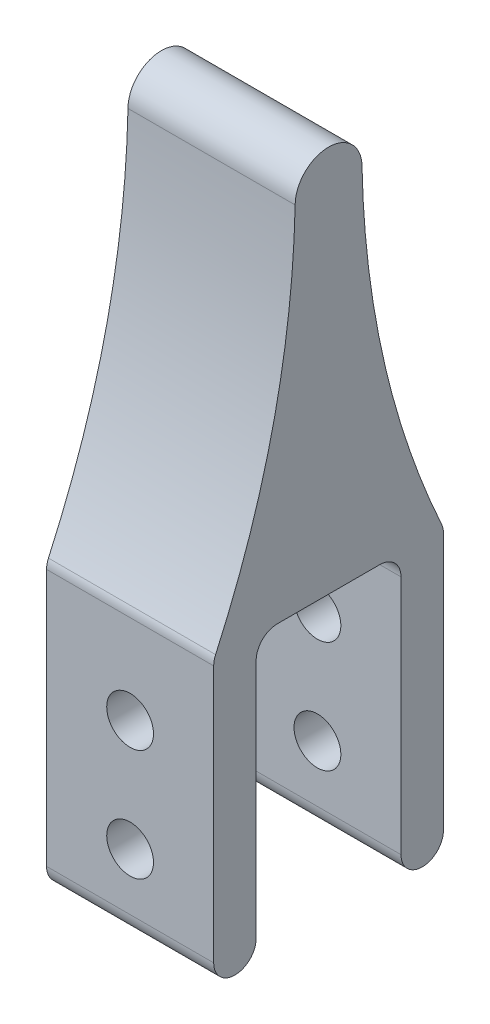
ISO-10303-21;
HEADER;
FILE_DESCRIPTION(('STEP AP214'),'2;1');
FILE_NAME('part.step','',(''),(''),'','','');
FILE_SCHEMA(('AUTOMOTIVE_DESIGN { 1 0 10303 214 1 1 1 1 }'));
ENDSEC;
DATA;
#1=APPLICATION_CONTEXT('core data for automotive mechanical design processes');
#2=APPLICATION_PROTOCOL_DEFINITION('international standard','automotive_design',2000,#1);
#3=PRODUCT_CONTEXT('',#1,'mechanical');
#4=PRODUCT('Part','Part','',(#3));
#5=PRODUCT_RELATED_PRODUCT_CATEGORY('part','',(#4));
#6=PRODUCT_DEFINITION_FORMATION('','',#4);
#7=PRODUCT_DEFINITION_CONTEXT('part definition',#1,'design');
#8=PRODUCT_DEFINITION('design','',#6,#7);
#9=PRODUCT_DEFINITION_SHAPE('','',#8);
#10=(LENGTH_UNIT() NAMED_UNIT(*) SI_UNIT(.MILLI.,.METRE.));
#11=(NAMED_UNIT(*) PLANE_ANGLE_UNIT() SI_UNIT($,.RADIAN.));
#12=(NAMED_UNIT(*) SI_UNIT($,.STERADIAN.) SOLID_ANGLE_UNIT());
#13=UNCERTAINTY_MEASURE_WITH_UNIT(LENGTH_MEASURE(1.E-05),#10,'distance_accuracy_value','');
#14=(GEOMETRIC_REPRESENTATION_CONTEXT(3) GLOBAL_UNCERTAINTY_ASSIGNED_CONTEXT((#13)) GLOBAL_UNIT_ASSIGNED_CONTEXT((#10,
#11,#12)) REPRESENTATION_CONTEXT('',''));
#15=CARTESIAN_POINT('',(0.,0.,0.));
#16=DIRECTION('',(0.,0.,1.));
#17=DIRECTION('',(1.,0.,0.));
#18=AXIS2_PLACEMENT_3D('',#15,#16,#17);
#19=CARTESIAN_POINT('',(15.,0.,6.5));
#20=DIRECTION('',(0.,0.,1.));
#21=DIRECTION('',(1.,0.,0.));
#22=AXIS2_PLACEMENT_3D('',#19,#20,#21);
#23=PLANE('',#22);
#24=CARTESIAN_POINT('',(7.5,7.,6.5));
#25=DIRECTION('',(0.,0.,1.));
#26=DIRECTION('',(1.,0.,0.));
#27=AXIS2_PLACEMENT_3D('',#24,#25,#26);
#28=CIRCLE('',#27,2.1);
#29=CARTESIAN_POINT('',(9.6,7.,6.5));
#30=VERTEX_POINT('',#29);
#31=EDGE_CURVE('E409',#30,#30,#28,.T.);
#32=ORIENTED_EDGE('',*,*,#31,.T.);
#33=EDGE_LOOP('',(#32));
#34=FACE_BOUND('',#33,.T.);
#35=CARTESIAN_POINT('',(7.5,17.,6.5));
#36=DIRECTION('',(0.,0.,1.));
#37=DIRECTION('',(1.,0.,0.));
#38=AXIS2_PLACEMENT_3D('',#35,#36,#37);
#39=CIRCLE('',#38,2.1);
#40=CARTESIAN_POINT('',(9.6,17.,6.5));
#41=VERTEX_POINT('',#40);
#42=EDGE_CURVE('E403',#41,#41,#39,.T.);
#43=ORIENTED_EDGE('',*,*,#42,.T.);
#44=EDGE_LOOP('',(#43));
#45=FACE_BOUND('',#44,.T.);
#46=DIRECTION('',(0.,1.,0.));
#47=VECTOR('',#46,1.);
#48=CARTESIAN_POINT('',(15.,0.,6.5));
#49=LINE('',#48,#47);
#50=CARTESIAN_POINT('',(15.,1.905,6.5));
#51=VERTEX_POINT('',#50);
#52=CARTESIAN_POINT('',(15.,23.495,6.5));
#53=VERTEX_POINT('',#52);
#54=EDGE_CURVE('E267',#51,#53,#49,.T.);
#55=ORIENTED_EDGE('',*,*,#54,.F.);
#56=DIRECTION('',(-1.,0.,0.));
#57=VECTOR('',#56,1.);
#58=CARTESIAN_POINT('',(15.,1.905,6.5));
#59=LINE('',#58,#57);
#60=CARTESIAN_POINT('',(0.,1.905,6.5));
#61=VERTEX_POINT('',#60);
#62=EDGE_CURVE('E298',#51,#61,#59,.T.);
#63=ORIENTED_EDGE('',*,*,#62,.T.);
#64=DIRECTION('',(0.,1.,0.));
#65=VECTOR('',#64,1.);
#66=CARTESIAN_POINT('',(0.,0.,6.5));
#67=LINE('',#66,#65);
#68=CARTESIAN_POINT('',(0.,23.495,6.5));
#69=VERTEX_POINT('',#68);
#70=EDGE_CURVE('E414',#61,#69,#67,.T.);
#71=ORIENTED_EDGE('',*,*,#70,.T.);
#72=DIRECTION('',(-1.,0.,0.));
#73=VECTOR('',#72,1.);
#74=CARTESIAN_POINT('',(15.,23.495,6.5));
#75=LINE('',#74,#73);
#76=EDGE_CURVE('E258',#69,#53,#75,.F.);
#77=ORIENTED_EDGE('',*,*,#76,.T.);
#78=EDGE_LOOP('',(#55,#63,#71,#77));
#79=FACE_BOUND('',#78,.T.);
#80=ADVANCED_FACE('F39',(#34,#45,#79),#23,.F.);
#81=CARTESIAN_POINT('',(15.,25.4,6.5));
#82=DIRECTION('',(0.,1.,0.));
#83=DIRECTION('',(0.,0.,1.));
#84=AXIS2_PLACEMENT_3D('',#81,#82,#83);
#85=PLANE('',#84);
#86=DIRECTION('',(0.,0.,-1.));
#87=VECTOR('',#86,1.);
#88=CARTESIAN_POINT('',(0.,25.4,6.5));
#89=LINE('',#88,#87);
#90=CARTESIAN_POINT('',(0.,25.4,4.595));
#91=VERTEX_POINT('',#90);
#92=CARTESIAN_POINT('',(0.,25.4,-4.595));
#93=VERTEX_POINT('',#92);
#94=EDGE_CURVE('E360',#91,#93,#89,.T.);
#95=ORIENTED_EDGE('',*,*,#94,.T.);
#96=DIRECTION('',(-1.,0.,0.));
#97=VECTOR('',#96,1.);
#98=CARTESIAN_POINT('',(15.,25.4,-4.595));
#99=LINE('',#98,#97);
#100=CARTESIAN_POINT('',(15.,25.4,-4.595));
#101=VERTEX_POINT('',#100);
#102=EDGE_CURVE('E271',#93,#101,#99,.F.);
#103=ORIENTED_EDGE('',*,*,#102,.T.);
#104=DIRECTION('',(0.,0.,-1.));
#105=VECTOR('',#104,1.);
#106=CARTESIAN_POINT('',(15.,25.4,6.5));
#107=LINE('',#106,#105);
#108=CARTESIAN_POINT('',(15.,25.4,4.595));
#109=VERTEX_POINT('',#108);
#110=EDGE_CURVE('E264',#109,#101,#107,.T.);
#111=ORIENTED_EDGE('',*,*,#110,.F.);
#112=DIRECTION('',(-1.,0.,0.));
#113=VECTOR('',#112,1.);
#114=CARTESIAN_POINT('',(0.,25.4,4.595));
#115=LINE('',#114,#113);
#116=EDGE_CURVE('E260',#109,#91,#115,.T.);
#117=ORIENTED_EDGE('',*,*,#116,.T.);
#118=EDGE_LOOP('',(#95,#103,#111,#117));
#119=FACE_BOUND('',#118,.T.);
#120=ADVANCED_FACE('F216',(#119),#85,.F.);
#121=CARTESIAN_POINT('',(15.,0.,-6.5));
#122=DIRECTION('',(0.,0.,-1.));
#123=DIRECTION('',(-1.,0.,0.));
#124=AXIS2_PLACEMENT_3D('',#121,#122,#123);
#125=PLANE('',#124);
#126=CARTESIAN_POINT('',(7.5,7.,-6.5));
#127=DIRECTION('',(0.,0.,-1.));
#128=DIRECTION('',(-1.,0.,0.));
#129=AXIS2_PLACEMENT_3D('',#126,#127,#128);
#130=CIRCLE('',#129,2.1);
#131=CARTESIAN_POINT('',(5.4,7.,-6.5));
#132=VERTEX_POINT('',#131);
#133=EDGE_CURVE('E405',#132,#132,#130,.T.);
#134=ORIENTED_EDGE('',*,*,#133,.T.);
#135=EDGE_LOOP('',(#134));
#136=FACE_BOUND('',#135,.T.);
#137=CARTESIAN_POINT('',(7.5,17.,-6.5));
#138=DIRECTION('',(0.,0.,-1.));
#139=DIRECTION('',(-1.,0.,0.));
#140=AXIS2_PLACEMENT_3D('',#137,#138,#139);
#141=CIRCLE('',#140,2.1);
#142=CARTESIAN_POINT('',(5.4,17.,-6.5));
#143=VERTEX_POINT('',#142);
#144=EDGE_CURVE('E406',#143,#143,#141,.T.);
#145=ORIENTED_EDGE('',*,*,#144,.T.);
#146=EDGE_LOOP('',(#145));
#147=FACE_BOUND('',#146,.T.);
#148=DIRECTION('',(0.,-1.,0.));
#149=VECTOR('',#148,1.);
#150=CARTESIAN_POINT('',(0.,0.,-6.5));
#151=LINE('',#150,#149);
#152=CARTESIAN_POINT('',(0.,23.495,-6.5));
#153=VERTEX_POINT('',#152);
#154=CARTESIAN_POINT('',(0.,1.905,-6.5));
#155=VERTEX_POINT('',#154);
#156=EDGE_CURVE('E355',#153,#155,#151,.T.);
#157=ORIENTED_EDGE('',*,*,#156,.T.);
#158=DIRECTION('',(-1.,0.,0.));
#159=VECTOR('',#158,1.);
#160=CARTESIAN_POINT('',(15.,1.905,-6.5));
#161=LINE('',#160,#159);
#162=CARTESIAN_POINT('',(15.,1.905,-6.5));
#163=VERTEX_POINT('',#162);
#164=EDGE_CURVE('E290',#155,#163,#161,.F.);
#165=ORIENTED_EDGE('',*,*,#164,.T.);
#166=DIRECTION('',(0.,-1.,0.));
#167=VECTOR('',#166,1.);
#168=CARTESIAN_POINT('',(15.,0.,-6.5));
#169=LINE('',#168,#167);
#170=CARTESIAN_POINT('',(15.,23.495,-6.5));
#171=VERTEX_POINT('',#170);
#172=EDGE_CURVE('E272',#171,#163,#169,.T.);
#173=ORIENTED_EDGE('',*,*,#172,.F.);
#174=DIRECTION('',(-1.,0.,0.));
#175=VECTOR('',#174,1.);
#176=CARTESIAN_POINT('',(0.,23.495,-6.5));
#177=LINE('',#176,#175);
#178=EDGE_CURVE('E287',#171,#153,#177,.T.);
#179=ORIENTED_EDGE('',*,*,#178,.T.);
#180=EDGE_LOOP('',(#157,#165,#173,#179));
#181=FACE_BOUND('',#180,.T.);
#182=ADVANCED_FACE('F212',(#136,#147,#181),#125,.F.);
#183=CARTESIAN_POINT('',(15.,0.,-10.31));
#184=DIRECTION('',(0.,0.,1.));
#185=DIRECTION('',(1.,0.,0.));
#186=AXIS2_PLACEMENT_3D('',#183,#184,#185);
#187=PLANE('',#186);
#188=CARTESIAN_POINT('',(7.5,7.,-10.31));
#189=DIRECTION('',(0.,0.,-1.));
#190=DIRECTION('',(-1.,0.,0.));
#191=AXIS2_PLACEMENT_3D('',#188,#189,#190);
#192=CIRCLE('',#191,2.1);
#193=CARTESIAN_POINT('',(5.4,7.,-10.31));
#194=VERTEX_POINT('',#193);
#195=EDGE_CURVE('E437',#194,#194,#192,.T.);
#196=ORIENTED_EDGE('',*,*,#195,.F.);
#197=EDGE_LOOP('',(#196));
#198=FACE_BOUND('',#197,.T.);
#199=CARTESIAN_POINT('',(7.5,17.,-10.31));
#200=DIRECTION('',(0.,0.,-1.));
#201=DIRECTION('',(-1.,0.,0.));
#202=AXIS2_PLACEMENT_3D('',#199,#200,#201);
#203=CIRCLE('',#202,2.1);
#204=CARTESIAN_POINT('',(5.4,17.,-10.31));
#205=VERTEX_POINT('',#204);
#206=EDGE_CURVE('E318',#205,#205,#203,.T.);
#207=ORIENTED_EDGE('',*,*,#206,.F.);
#208=EDGE_LOOP('',(#207));
#209=FACE_BOUND('',#208,.T.);
#210=DIRECTION('',(0.,1.,0.));
#211=VECTOR('',#210,1.);
#212=CARTESIAN_POINT('',(0.,0.,-10.31));
#213=LINE('',#212,#211);
#214=CARTESIAN_POINT('',(0.,1.905,-10.31));
#215=VERTEX_POINT('',#214);
#216=CARTESIAN_POINT('',(0.,24.983647338557,-10.31));
#217=VERTEX_POINT('',#216);
#218=EDGE_CURVE('E353',#215,#217,#213,.T.);
#219=ORIENTED_EDGE('',*,*,#218,.T.);
#220=DIRECTION('',(-1.,0.,0.));
#221=VECTOR('',#220,1.);
#222=CARTESIAN_POINT('',(15.,24.983647338557,-10.31));
#223=LINE('',#222,#221);
#224=CARTESIAN_POINT('',(15.,24.983647338557,-10.31));
#225=VERTEX_POINT('',#224);
#226=EDGE_CURVE('E286',#217,#225,#223,.F.);
#227=ORIENTED_EDGE('',*,*,#226,.T.);
#228=DIRECTION('',(0.,1.,0.));
#229=VECTOR('',#228,1.);
#230=CARTESIAN_POINT('',(15.,0.,-10.31));
#231=LINE('',#230,#229);
#232=CARTESIAN_POINT('',(15.,1.905,-10.31));
#233=VERTEX_POINT('',#232);
#234=EDGE_CURVE('E166',#233,#225,#231,.T.);
#235=ORIENTED_EDGE('',*,*,#234,.F.);
#236=DIRECTION('',(-1.,0.,0.));
#237=VECTOR('',#236,1.);
#238=CARTESIAN_POINT('',(15.,1.905,-10.31));
#239=LINE('',#238,#237);
#240=EDGE_CURVE('E341',#233,#215,#239,.T.);
#241=ORIENTED_EDGE('',*,*,#240,.T.);
#242=EDGE_LOOP('',(#219,#227,#235,#241));
#243=FACE_BOUND('',#242,.T.);
#244=ADVANCED_FACE('F209',(#198,#209,#243),#187,.F.);
#245=CARTESIAN_POINT('',(15.,25.4,-10.31));
#246=CARTESIAN_POINT('',(15.,40.4223600556114,-3.36806425681893));
#247=CARTESIAN_POINT('',(15.,57.15,-3.));
#248=B_SPLINE_CURVE_WITH_KNOTS('',2,(#245,#246,#247),.UNSPECIFIED.,.F.,.F.,(3,3),(0.,1.),.UNSPECIFIED.);
#249=DIRECTION('',(-1.,0.,0.));
#250=VECTOR('',#249,1.);
#251=SURFACE_OF_LINEAR_EXTRUSION('',#248,#250);
#252=CARTESIAN_POINT('',(15.,25.7740573539698,-10.1382850335519));
#253=VERTEX_POINT('',#252);
#254=CARTESIAN_POINT('',(15.,57.15,-3.));
#255=VERTEX_POINT('',#254);
#256=EDGE_CURVE('E153',#253,#255,#248,.T.);
#257=ORIENTED_EDGE('',*,*,#256,.F.);
#258=DIRECTION('',(-1.,0.,0.));
#259=VECTOR('',#258,1.);
#260=CARTESIAN_POINT('',(15.,25.7740573539698,-10.1382850335519));
#261=LINE('',#260,#259);
#262=CARTESIAN_POINT('',(0.,25.7740573539698,-10.1382850335519));
#263=VERTEX_POINT('',#262);
#264=EDGE_CURVE('E175',#253,#263,#261,.T.);
#265=ORIENTED_EDGE('',*,*,#264,.T.);
#266=CARTESIAN_POINT('',(0.,25.4,-10.31));
#267=CARTESIAN_POINT('',(0.,40.4223600556114,-3.36806425681893));
#268=CARTESIAN_POINT('',(0.,57.15,-3.));
#269=B_SPLINE_CURVE_WITH_KNOTS('',2,(#266,#267,#268),.UNSPECIFIED.,.F.,.F.,(3,3),(0.,1.),.UNSPECIFIED.);
#270=CARTESIAN_POINT('',(0.,57.15,-3.));
#271=VERTEX_POINT('',#270);
#272=EDGE_CURVE('E172',#263,#271,#269,.T.);
#273=ORIENTED_EDGE('',*,*,#272,.T.);
#274=DIRECTION('',(-1.,0.,0.));
#275=VECTOR('',#274,1.);
#276=CARTESIAN_POINT('',(15.,57.15,-3.));
#277=LINE('',#276,#275);
#278=EDGE_CURVE('E169',#255,#271,#277,.T.);
#279=ORIENTED_EDGE('',*,*,#278,.F.);
#280=EDGE_LOOP('',(#257,#265,#273,#279));
#281=FACE_BOUND('',#280,.T.);
#282=ADVANCED_FACE('F170',(#281),#251,.F.);
#283=CARTESIAN_POINT('',(15.,57.15,0.));
#284=DIRECTION('',(-1.,0.,0.));
#285=DIRECTION('',(0.,0.,1.));
#286=AXIS2_PLACEMENT_3D('',#283,#284,#285);
#287=CYLINDRICAL_SURFACE('',#286,3.);
#288=CARTESIAN_POINT('',(0.,57.15,0.));
#289=DIRECTION('',(1.,0.,0.));
#290=DIRECTION('',(0.,0.,-1.));
#291=AXIS2_PLACEMENT_3D('',#288,#289,#290);
#292=CIRCLE('',#291,3.);
#293=CARTESIAN_POINT('',(0.,57.15,3.));
#294=VERTEX_POINT('',#293);
#295=EDGE_CURVE('E357',#271,#294,#292,.T.);
#296=ORIENTED_EDGE('',*,*,#295,.T.);
#297=DIRECTION('',(-1.,0.,0.));
#298=VECTOR('',#297,1.);
#299=CARTESIAN_POINT('',(15.,57.15,3.));
#300=LINE('',#299,#298);
#301=CARTESIAN_POINT('',(15.,57.15,3.));
#302=VERTEX_POINT('',#301);
#303=EDGE_CURVE('E176',#302,#294,#300,.T.);
#304=ORIENTED_EDGE('',*,*,#303,.F.);
#305=CARTESIAN_POINT('',(15.,57.15,0.));
#306=DIRECTION('',(1.,0.,0.));
#307=DIRECTION('',(0.,0.,-1.));
#308=AXIS2_PLACEMENT_3D('',#305,#306,#307);
#309=CIRCLE('',#308,3.);
#310=EDGE_CURVE('E159',#255,#302,#309,.T.);
#311=ORIENTED_EDGE('',*,*,#310,.F.);
#312=ORIENTED_EDGE('',*,*,#278,.T.);
#313=EDGE_LOOP('',(#296,#304,#311,#312));
#314=FACE_BOUND('',#313,.T.);
#315=ADVANCED_FACE('F178',(#314),#287,.T.);
#316=CARTESIAN_POINT('',(15.,57.15,3.));
#317=CARTESIAN_POINT('',(15.,40.4223600556114,3.36806425681893));
#318=CARTESIAN_POINT('',(15.,25.4,10.31));
#319=B_SPLINE_CURVE_WITH_KNOTS('',2,(#316,#317,#318),.UNSPECIFIED.,.F.,.F.,(3,3),(0.,1.),.UNSPECIFIED.);
#320=DIRECTION('',(-1.,0.,0.));
#321=VECTOR('',#320,1.);
#322=SURFACE_OF_LINEAR_EXTRUSION('',#319,#321);
#323=CARTESIAN_POINT('',(0.,57.15,3.));
#324=CARTESIAN_POINT('',(0.,40.4223600556114,3.36806425681893));
#325=CARTESIAN_POINT('',(0.,25.4,10.31));
#326=B_SPLINE_CURVE_WITH_KNOTS('',2,(#323,#324,#325),.UNSPECIFIED.,.F.,.F.,(3,3),(0.,1.),.UNSPECIFIED.);
#327=CARTESIAN_POINT('',(0.,25.7740573539698,10.1382850335519));
#328=VERTEX_POINT('',#327);
#329=EDGE_CURVE('E370',#294,#328,#326,.T.);
#330=ORIENTED_EDGE('',*,*,#329,.T.);
#331=DIRECTION('',(-1.,0.,0.));
#332=VECTOR('',#331,1.);
#333=CARTESIAN_POINT('',(0.,25.7740573539698,10.1382850335519));
#334=LINE('',#333,#332);
#335=CARTESIAN_POINT('',(15.,25.7740573539698,10.1382850335519));
#336=VERTEX_POINT('',#335);
#337=EDGE_CURVE('E307',#328,#336,#334,.F.);
#338=ORIENTED_EDGE('',*,*,#337,.T.);
#339=EDGE_CURVE('E181',#302,#336,#319,.T.);
#340=ORIENTED_EDGE('',*,*,#339,.F.);
#341=ORIENTED_EDGE('',*,*,#303,.T.);
#342=EDGE_LOOP('',(#330,#338,#340,#341));
#343=FACE_BOUND('',#342,.T.);
#344=ADVANCED_FACE('F198',(#343),#322,.F.);
#345=CARTESIAN_POINT('',(15.,0.,10.31));
#346=DIRECTION('',(0.,0.,-1.));
#347=DIRECTION('',(-1.,0.,0.));
#348=AXIS2_PLACEMENT_3D('',#345,#346,#347);
#349=PLANE('',#348);
#350=CARTESIAN_POINT('',(7.5,7.,10.31));
#351=DIRECTION('',(0.,0.,-1.));
#352=DIRECTION('',(-1.,0.,0.));
#353=AXIS2_PLACEMENT_3D('',#350,#351,#352);
#354=CIRCLE('',#353,2.1);
#355=CARTESIAN_POINT('',(5.4,7.,10.31));
#356=VERTEX_POINT('',#355);
#357=EDGE_CURVE('E392',#356,#356,#354,.T.);
#358=ORIENTED_EDGE('',*,*,#357,.T.);
#359=EDGE_LOOP('',(#358));
#360=FACE_BOUND('',#359,.T.);
#361=CARTESIAN_POINT('',(7.5,17.,10.31));
#362=DIRECTION('',(0.,0.,-1.));
#363=DIRECTION('',(-1.,0.,0.));
#364=AXIS2_PLACEMENT_3D('',#361,#362,#363);
#365=CIRCLE('',#364,2.1);
#366=CARTESIAN_POINT('',(5.4,17.,10.31));
#367=VERTEX_POINT('',#366);
#368=EDGE_CURVE('E315',#367,#367,#365,.T.);
#369=ORIENTED_EDGE('',*,*,#368,.T.);
#370=EDGE_LOOP('',(#369));
#371=FACE_BOUND('',#370,.T.);
#372=DIRECTION('',(0.,-1.,0.));
#373=VECTOR('',#372,1.);
#374=CARTESIAN_POINT('',(0.,0.,10.31));
#375=LINE('',#374,#373);
#376=CARTESIAN_POINT('',(0.,24.983647338557,10.31));
#377=VERTEX_POINT('',#376);
#378=CARTESIAN_POINT('',(0.,1.905,10.31));
#379=VERTEX_POINT('',#378);
#380=EDGE_CURVE('E276',#377,#379,#375,.T.);
#381=ORIENTED_EDGE('',*,*,#380,.T.);
#382=DIRECTION('',(-1.,0.,0.));
#383=VECTOR('',#382,1.);
#384=CARTESIAN_POINT('',(15.,1.905,10.31));
#385=LINE('',#384,#383);
#386=CARTESIAN_POINT('',(15.,1.905,10.31));
#387=VERTEX_POINT('',#386);
#388=EDGE_CURVE('E64',#379,#387,#385,.F.);
#389=ORIENTED_EDGE('',*,*,#388,.T.);
#390=DIRECTION('',(0.,-1.,0.));
#391=VECTOR('',#390,1.);
#392=CARTESIAN_POINT('',(15.,0.,10.31));
#393=LINE('',#392,#391);
#394=CARTESIAN_POINT('',(15.,24.983647338557,10.31));
#395=VERTEX_POINT('',#394);
#396=EDGE_CURVE('E183',#395,#387,#393,.T.);
#397=ORIENTED_EDGE('',*,*,#396,.F.);
#398=DIRECTION('',(-1.,0.,0.));
#399=VECTOR('',#398,1.);
#400=CARTESIAN_POINT('',(15.,24.983647338557,10.31));
#401=LINE('',#400,#399);
#402=EDGE_CURVE('E301',#395,#377,#401,.T.);
#403=ORIENTED_EDGE('',*,*,#402,.T.);
#404=EDGE_LOOP('',(#381,#389,#397,#403));
#405=FACE_BOUND('',#404,.T.);
#406=ADVANCED_FACE('F202',(#360,#371,#405),#349,.F.);
#407=CARTESIAN_POINT('',(15.,40.8486800278057,-5.01153212840947));
#408=DIRECTION('',(1.,0.,0.));
#409=DIRECTION('',(0.,0.,-1.));
#410=AXIS2_PLACEMENT_3D('',#407,#408,#409);
#411=PLANE('',#410);
#412=ORIENTED_EDGE('',*,*,#234,.T.);
#413=CARTESIAN_POINT('',(15.,24.983647338557,-8.405));
#414=DIRECTION('',(1.,0.,0.));
#415=DIRECTION('',(0.,0.,-1.));
#416=AXIS2_PLACEMENT_3D('',#413,#414,#415);
#417=CIRCLE('',#416,1.905);
#418=EDGE_CURVE('E162',#225,#253,#417,.T.);
#419=ORIENTED_EDGE('',*,*,#418,.T.);
#420=ORIENTED_EDGE('',*,*,#256,.T.);
#421=ORIENTED_EDGE('',*,*,#310,.T.);
#422=ORIENTED_EDGE('',*,*,#339,.T.);
#423=CARTESIAN_POINT('',(15.,24.983647338557,8.405));
#424=DIRECTION('',(1.,0.,0.));
#425=DIRECTION('',(0.,0.,-1.));
#426=AXIS2_PLACEMENT_3D('',#423,#424,#425);
#427=CIRCLE('',#426,1.905);
#428=EDGE_CURVE('E344',#336,#395,#427,.T.);
#429=ORIENTED_EDGE('',*,*,#428,.T.);
#430=ORIENTED_EDGE('',*,*,#396,.T.);
#431=CARTESIAN_POINT('',(15.,1.905,8.405));
#432=DIRECTION('',(1.,0.,0.));
#433=DIRECTION('',(0.,0.,-1.));
#434=AXIS2_PLACEMENT_3D('',#431,#432,#433);
#435=CIRCLE('',#434,1.905);
#436=CARTESIAN_POINT('',(15.,0.,8.405));
#437=VERTEX_POINT('',#436);
#438=EDGE_CURVE('E56',#387,#437,#435,.T.);
#439=ORIENTED_EDGE('',*,*,#438,.T.);
#440=CARTESIAN_POINT('',(15.,1.905,8.405));
#441=DIRECTION('',(1.,0.,0.));
#442=DIRECTION('',(0.,0.,-1.));
#443=AXIS2_PLACEMENT_3D('',#440,#441,#442);
#444=CIRCLE('',#443,1.905);
#445=EDGE_CURVE('E324',#437,#51,#444,.T.);
#446=ORIENTED_EDGE('',*,*,#445,.T.);
#447=ORIENTED_EDGE('',*,*,#54,.T.);
#448=CARTESIAN_POINT('',(15.,23.495,4.595));
#449=DIRECTION('',(1.,0.,0.));
#450=DIRECTION('',(0.,0.,-1.));
#451=AXIS2_PLACEMENT_3D('',#448,#449,#450);
#452=CIRCLE('',#451,1.905);
#453=EDGE_CURVE('E11',#53,#109,#452,.F.);
#454=ORIENTED_EDGE('',*,*,#453,.T.);
#455=ORIENTED_EDGE('',*,*,#110,.T.);
#456=CARTESIAN_POINT('',(15.,23.495,-4.595));
#457=DIRECTION('',(1.,0.,0.));
#458=DIRECTION('',(0.,0.,-1.));
#459=AXIS2_PLACEMENT_3D('',#456,#457,#458);
#460=CIRCLE('',#459,1.905);
#461=EDGE_CURVE('E311',#101,#171,#460,.F.);
#462=ORIENTED_EDGE('',*,*,#461,.T.);
#463=ORIENTED_EDGE('',*,*,#172,.T.);
#464=CARTESIAN_POINT('',(15.,1.905,-8.405));
#465=DIRECTION('',(1.,0.,0.));
#466=DIRECTION('',(0.,0.,-1.));
#467=AXIS2_PLACEMENT_3D('',#464,#465,#466);
#468=CIRCLE('',#467,1.905);
#469=CARTESIAN_POINT('',(15.,0.,-8.405));
#470=VERTEX_POINT('',#469);
#471=EDGE_CURVE('E292',#163,#470,#468,.T.);
#472=ORIENTED_EDGE('',*,*,#471,.T.);
#473=CARTESIAN_POINT('',(15.,1.905,-8.405));
#474=DIRECTION('',(1.,0.,0.));
#475=DIRECTION('',(0.,0.,-1.));
#476=AXIS2_PLACEMENT_3D('',#473,#474,#475);
#477=CIRCLE('',#476,1.905);
#478=EDGE_CURVE('E281',#470,#233,#477,.T.);
#479=ORIENTED_EDGE('',*,*,#478,.T.);
#480=EDGE_LOOP('',(#412,#419,#420,#421,#422,#429,#430,#439,#446,#447,#454,#455,#462,#463,#472,#479));
#481=FACE_BOUND('',#480,.T.);
#482=ADVANCED_FACE('F156',(#481),#411,.T.);
#483=CARTESIAN_POINT('',(0.,40.8486800278057,-5.01153212840947));
#484=DIRECTION('',(1.,0.,0.));
#485=DIRECTION('',(0.,0.,-1.));
#486=AXIS2_PLACEMENT_3D('',#483,#484,#485);
#487=PLANE('',#486);
#488=ORIENTED_EDGE('',*,*,#272,.F.);
#489=CARTESIAN_POINT('',(0.,24.983647338557,-8.405));
#490=DIRECTION('',(1.,0.,0.));
#491=DIRECTION('',(0.,0.,-1.));
#492=AXIS2_PLACEMENT_3D('',#489,#490,#491);
#493=CIRCLE('',#492,1.905);
#494=EDGE_CURVE('E339',#263,#217,#493,.F.);
#495=ORIENTED_EDGE('',*,*,#494,.T.);
#496=ORIENTED_EDGE('',*,*,#218,.F.);
#497=CARTESIAN_POINT('',(0.,1.905,-8.405));
#498=DIRECTION('',(1.,0.,0.));
#499=DIRECTION('',(0.,0.,-1.));
#500=AXIS2_PLACEMENT_3D('',#497,#498,#499);
#501=CIRCLE('',#500,1.905);
#502=CARTESIAN_POINT('',(0.,0.,-8.405));
#503=VERTEX_POINT('',#502);
#504=EDGE_CURVE('E337',#215,#503,#501,.F.);
#505=ORIENTED_EDGE('',*,*,#504,.T.);
#506=CARTESIAN_POINT('',(0.,1.905,-8.405));
#507=DIRECTION('',(1.,0.,0.));
#508=DIRECTION('',(0.,0.,-1.));
#509=AXIS2_PLACEMENT_3D('',#506,#507,#508);
#510=CIRCLE('',#509,1.905);
#511=EDGE_CURVE('E331',#503,#155,#510,.F.);
#512=ORIENTED_EDGE('',*,*,#511,.T.);
#513=ORIENTED_EDGE('',*,*,#156,.F.);
#514=CARTESIAN_POINT('',(0.,23.495,-4.595));
#515=DIRECTION('',(1.,0.,0.));
#516=DIRECTION('',(0.,0.,-1.));
#517=AXIS2_PLACEMENT_3D('',#514,#515,#516);
#518=CIRCLE('',#517,1.905);
#519=EDGE_CURVE('E309',#153,#93,#518,.T.);
#520=ORIENTED_EDGE('',*,*,#519,.T.);
#521=ORIENTED_EDGE('',*,*,#94,.F.);
#522=CARTESIAN_POINT('',(0.,23.495,4.595));
#523=DIRECTION('',(1.,0.,0.));
#524=DIRECTION('',(0.,0.,-1.));
#525=AXIS2_PLACEMENT_3D('',#522,#523,#524);
#526=CIRCLE('',#525,1.905);
#527=EDGE_CURVE('E48',#91,#69,#526,.T.);
#528=ORIENTED_EDGE('',*,*,#527,.T.);
#529=ORIENTED_EDGE('',*,*,#70,.F.);
#530=CARTESIAN_POINT('',(0.,1.905,8.405));
#531=DIRECTION('',(1.,0.,0.));
#532=DIRECTION('',(0.,0.,-1.));
#533=AXIS2_PLACEMENT_3D('',#530,#531,#532);
#534=CIRCLE('',#533,1.905);
#535=CARTESIAN_POINT('',(0.,0.,8.405));
#536=VERTEX_POINT('',#535);
#537=EDGE_CURVE('E323',#61,#536,#534,.F.);
#538=ORIENTED_EDGE('',*,*,#537,.T.);
#539=CARTESIAN_POINT('',(0.,1.905,8.405));
#540=DIRECTION('',(1.,0.,0.));
#541=DIRECTION('',(0.,0.,-1.));
#542=AXIS2_PLACEMENT_3D('',#539,#540,#541);
#543=CIRCLE('',#542,1.905);
#544=EDGE_CURVE('E326',#536,#379,#543,.F.);
#545=ORIENTED_EDGE('',*,*,#544,.T.);
#546=ORIENTED_EDGE('',*,*,#380,.F.);
#547=CARTESIAN_POINT('',(0.,24.983647338557,8.405));
#548=DIRECTION('',(1.,0.,0.));
#549=DIRECTION('',(0.,0.,-1.));
#550=AXIS2_PLACEMENT_3D('',#547,#548,#549);
#551=CIRCLE('',#550,1.905);
#552=EDGE_CURVE('E329',#377,#328,#551,.F.);
#553=ORIENTED_EDGE('',*,*,#552,.T.);
#554=ORIENTED_EDGE('',*,*,#329,.F.);
#555=ORIENTED_EDGE('',*,*,#295,.F.);
#556=EDGE_LOOP('',(#488,#495,#496,#505,#512,#513,#520,#521,#528,#529,#538,#545,#546,#553,#554,#555));
#557=FACE_BOUND('',#556,.T.);
#558=ADVANCED_FACE('F354',(#557),#487,.F.);
#559=CARTESIAN_POINT('',(7.5,17.,10.31));
#560=DIRECTION('',(0.,0.,-1.));
#561=DIRECTION('',(-1.,0.,0.));
#562=AXIS2_PLACEMENT_3D('',#559,#560,#561);
#563=CYLINDRICAL_SURFACE('',#562,2.1);
#564=ORIENTED_EDGE('',*,*,#368,.F.);
#565=EDGE_LOOP('',(#564));
#566=FACE_BOUND('',#565,.T.);
#567=ORIENTED_EDGE('',*,*,#42,.F.);
#568=EDGE_LOOP('',(#567));
#569=FACE_BOUND('',#568,.T.);
#570=ADVANCED_FACE('F395',(#566,#569),#563,.F.);
#571=CARTESIAN_POINT('',(7.5,7.,10.31));
#572=DIRECTION('',(0.,0.,-1.));
#573=DIRECTION('',(-1.,0.,0.));
#574=AXIS2_PLACEMENT_3D('',#571,#572,#573);
#575=CYLINDRICAL_SURFACE('',#574,2.1);
#576=ORIENTED_EDGE('',*,*,#357,.F.);
#577=EDGE_LOOP('',(#576));
#578=FACE_BOUND('',#577,.T.);
#579=ORIENTED_EDGE('',*,*,#31,.F.);
#580=EDGE_LOOP('',(#579));
#581=FACE_BOUND('',#580,.T.);
#582=ADVANCED_FACE('F398',(#578,#581),#575,.F.);
#583=ORIENTED_EDGE('',*,*,#206,.T.);
#584=EDGE_LOOP('',(#583));
#585=FACE_BOUND('',#584,.T.);
#586=ORIENTED_EDGE('',*,*,#144,.F.);
#587=EDGE_LOOP('',(#586));
#588=FACE_BOUND('',#587,.T.);
#589=ADVANCED_FACE('F400',(#585,#588),#563,.F.);
#590=ORIENTED_EDGE('',*,*,#195,.T.);
#591=EDGE_LOOP('',(#590));
#592=FACE_BOUND('',#591,.T.);
#593=ORIENTED_EDGE('',*,*,#133,.F.);
#594=EDGE_LOOP('',(#593));
#595=FACE_BOUND('',#594,.T.);
#596=ADVANCED_FACE('F228',(#592,#595),#575,.F.);
#597=CARTESIAN_POINT('',(7.5,24.983647338557,-8.405));
#598=DIRECTION('',(-1.,0.,0.));
#599=DIRECTION('',(0.,0.,1.));
#600=AXIS2_PLACEMENT_3D('',#597,#598,#599);
#601=CYLINDRICAL_SURFACE('',#600,1.905);
#602=ORIENTED_EDGE('',*,*,#418,.F.);
#603=ORIENTED_EDGE('',*,*,#226,.F.);
#604=ORIENTED_EDGE('',*,*,#494,.F.);
#605=ORIENTED_EDGE('',*,*,#264,.F.);
#606=EDGE_LOOP('',(#602,#603,#604,#605));
#607=FACE_BOUND('',#606,.T.);
#608=ADVANCED_FACE('F224',(#607),#601,.T.);
#609=CARTESIAN_POINT('',(15.,1.905,-8.405));
#610=DIRECTION('',(-1.,0.,0.));
#611=DIRECTION('',(0.,0.,1.));
#612=AXIS2_PLACEMENT_3D('',#609,#610,#611);
#613=CYLINDRICAL_SURFACE('',#612,1.905);
#614=DIRECTION('',(-1.,0.,0.));
#615=VECTOR('',#614,1.);
#616=CARTESIAN_POINT('',(15.,0.,-8.405));
#617=LINE('',#616,#615);
#618=EDGE_CURVE('E313',#470,#503,#617,.T.);
#619=ORIENTED_EDGE('',*,*,#618,.F.);
#620=ORIENTED_EDGE('',*,*,#471,.F.);
#621=ORIENTED_EDGE('',*,*,#164,.F.);
#622=ORIENTED_EDGE('',*,*,#511,.F.);
#623=EDGE_LOOP('',(#619,#620,#621,#622));
#624=FACE_BOUND('',#623,.T.);
#625=ADVANCED_FACE('F227',(#624),#613,.T.);
#626=CARTESIAN_POINT('',(15.,1.905,-8.405));
#627=DIRECTION('',(-1.,0.,0.));
#628=DIRECTION('',(0.,0.,1.));
#629=AXIS2_PLACEMENT_3D('',#626,#627,#628);
#630=CYLINDRICAL_SURFACE('',#629,1.905);
#631=ORIENTED_EDGE('',*,*,#478,.F.);
#632=ORIENTED_EDGE('',*,*,#618,.T.);
#633=ORIENTED_EDGE('',*,*,#504,.F.);
#634=ORIENTED_EDGE('',*,*,#240,.F.);
#635=EDGE_LOOP('',(#631,#632,#633,#634));
#636=FACE_BOUND('',#635,.T.);
#637=ADVANCED_FACE('F230',(#636),#630,.T.);
#638=CARTESIAN_POINT('',(15.,1.905,8.405));
#639=DIRECTION('',(-1.,0.,0.));
#640=DIRECTION('',(0.,0.,1.));
#641=AXIS2_PLACEMENT_3D('',#638,#639,#640);
#642=CYLINDRICAL_SURFACE('',#641,1.905);
#643=DIRECTION('',(-1.,0.,0.));
#644=VECTOR('',#643,1.);
#645=CARTESIAN_POINT('',(15.,0.,8.405));
#646=LINE('',#645,#644);
#647=EDGE_CURVE('E43',#437,#536,#646,.T.);
#648=ORIENTED_EDGE('',*,*,#647,.F.);
#649=ORIENTED_EDGE('',*,*,#438,.F.);
#650=ORIENTED_EDGE('',*,*,#388,.F.);
#651=ORIENTED_EDGE('',*,*,#544,.F.);
#652=EDGE_LOOP('',(#648,#649,#650,#651));
#653=FACE_BOUND('',#652,.T.);
#654=ADVANCED_FACE('F233',(#653),#642,.T.);
#655=CARTESIAN_POINT('',(15.,1.905,8.405));
#656=DIRECTION('',(-1.,0.,0.));
#657=DIRECTION('',(0.,0.,1.));
#658=AXIS2_PLACEMENT_3D('',#655,#656,#657);
#659=CYLINDRICAL_SURFACE('',#658,1.905);
#660=ORIENTED_EDGE('',*,*,#445,.F.);
#661=ORIENTED_EDGE('',*,*,#647,.T.);
#662=ORIENTED_EDGE('',*,*,#537,.F.);
#663=ORIENTED_EDGE('',*,*,#62,.F.);
#664=EDGE_LOOP('',(#660,#661,#662,#663));
#665=FACE_BOUND('',#664,.T.);
#666=ADVANCED_FACE('F238',(#665),#659,.T.);
#667=CARTESIAN_POINT('',(15.,23.495,-4.595));
#668=DIRECTION('',(1.,0.,0.));
#669=DIRECTION('',(0.,0.,-1.));
#670=AXIS2_PLACEMENT_3D('',#667,#668,#669);
#671=CYLINDRICAL_SURFACE('',#670,1.905);
#672=ORIENTED_EDGE('',*,*,#461,.F.);
#673=ORIENTED_EDGE('',*,*,#102,.F.);
#674=ORIENTED_EDGE('',*,*,#519,.F.);
#675=ORIENTED_EDGE('',*,*,#178,.F.);
#676=EDGE_LOOP('',(#672,#673,#674,#675));
#677=FACE_BOUND('',#676,.T.);
#678=ADVANCED_FACE('F241',(#677),#671,.F.);
#679=CARTESIAN_POINT('',(15.,23.495,4.595));
#680=DIRECTION('',(1.,0.,0.));
#681=DIRECTION('',(0.,0.,-1.));
#682=AXIS2_PLACEMENT_3D('',#679,#680,#681);
#683=CYLINDRICAL_SURFACE('',#682,1.905);
#684=ORIENTED_EDGE('',*,*,#453,.F.);
#685=ORIENTED_EDGE('',*,*,#76,.F.);
#686=ORIENTED_EDGE('',*,*,#527,.F.);
#687=ORIENTED_EDGE('',*,*,#116,.F.);
#688=EDGE_LOOP('',(#684,#685,#686,#687));
#689=FACE_BOUND('',#688,.T.);
#690=ADVANCED_FACE('F247',(#689),#683,.F.);
#691=CARTESIAN_POINT('',(7.5,24.983647338557,8.405));
#692=DIRECTION('',(-1.,0.,0.));
#693=DIRECTION('',(0.,0.,1.));
#694=AXIS2_PLACEMENT_3D('',#691,#692,#693);
#695=CYLINDRICAL_SURFACE('',#694,1.905);
#696=ORIENTED_EDGE('',*,*,#428,.F.);
#697=ORIENTED_EDGE('',*,*,#337,.F.);
#698=ORIENTED_EDGE('',*,*,#552,.F.);
#699=ORIENTED_EDGE('',*,*,#402,.F.);
#700=EDGE_LOOP('',(#696,#697,#698,#699));
#701=FACE_BOUND('',#700,.T.);
#702=ADVANCED_FACE('F41',(#701),#695,.T.);
#703=CLOSED_SHELL('',(#80,#120,#182,#244,#282,#315,#344,#406,#482,#558,#570,#582,#589,#596,#608,
#625,#637,#654,#666,#678,#690,#702));
#704=MANIFOLD_SOLID_BREP('B2',#703);
#705=ADVANCED_BREP_SHAPE_REPRESENTATION('',(#18,#704),#14);
#706=SHAPE_DEFINITION_REPRESENTATION(#9,#705);
ENDSEC;
END-ISO-10303-21;
